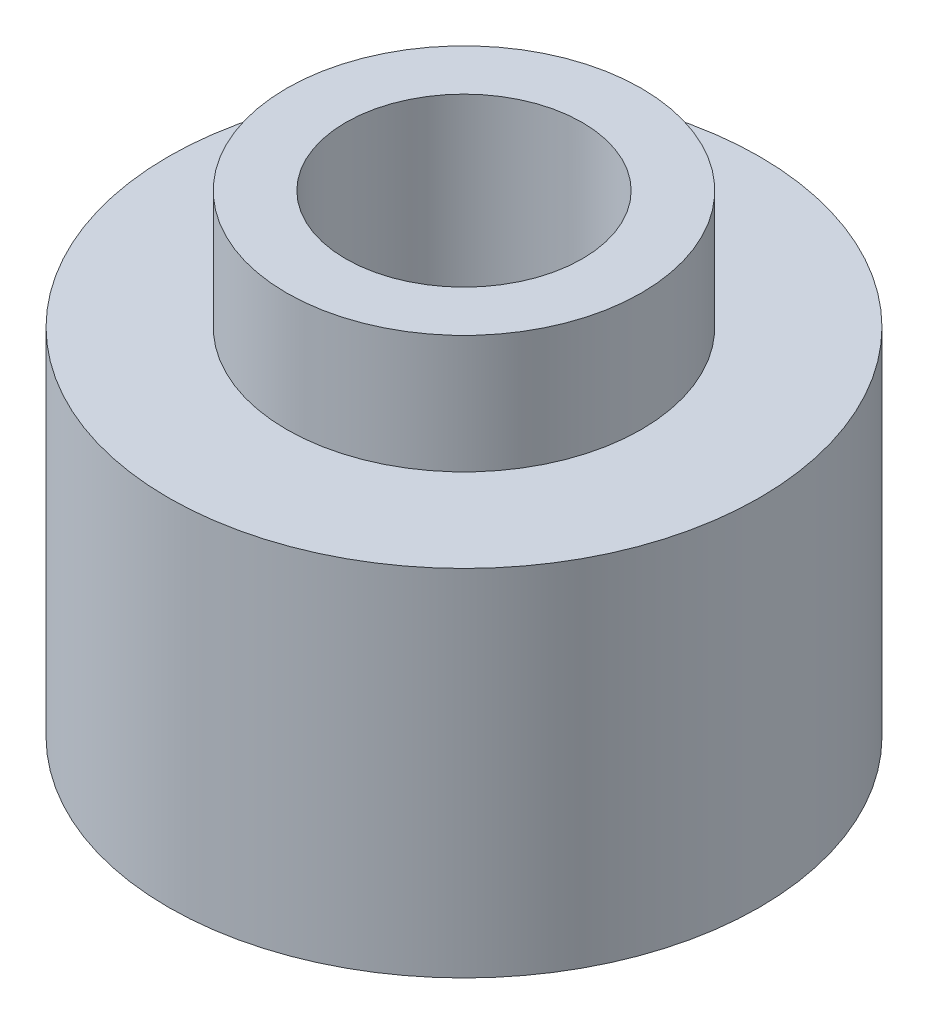
ISO-10303-21;
HEADER;
FILE_DESCRIPTION(('STEP AP214'),'2;1');
FILE_NAME('part.step','',(''),(''),'','','');
FILE_SCHEMA(('AUTOMOTIVE_DESIGN { 1 0 10303 214 1 1 1 1 }'));
ENDSEC;
DATA;
#1=APPLICATION_CONTEXT('core data for automotive mechanical design processes');
#2=APPLICATION_PROTOCOL_DEFINITION('international standard','automotive_design',2000,#1);
#3=PRODUCT_CONTEXT('',#1,'mechanical');
#4=PRODUCT('Part','Part','',(#3));
#5=PRODUCT_RELATED_PRODUCT_CATEGORY('part','',(#4));
#6=PRODUCT_DEFINITION_FORMATION('','',#4);
#7=PRODUCT_DEFINITION_CONTEXT('part definition',#1,'design');
#8=PRODUCT_DEFINITION('design','',#6,#7);
#9=PRODUCT_DEFINITION_SHAPE('','',#8);
#10=(LENGTH_UNIT() NAMED_UNIT(*) SI_UNIT(.MILLI.,.METRE.));
#11=(NAMED_UNIT(*) PLANE_ANGLE_UNIT() SI_UNIT($,.RADIAN.));
#12=(NAMED_UNIT(*) SI_UNIT($,.STERADIAN.) SOLID_ANGLE_UNIT());
#13=UNCERTAINTY_MEASURE_WITH_UNIT(LENGTH_MEASURE(1.E-05),#10,'distance_accuracy_value','');
#14=(GEOMETRIC_REPRESENTATION_CONTEXT(3) GLOBAL_UNCERTAINTY_ASSIGNED_CONTEXT((#13)) GLOBAL_UNIT_ASSIGNED_CONTEXT((#10,
#11,#12)) REPRESENTATION_CONTEXT('',''));
#15=CARTESIAN_POINT('',(0.,0.,0.));
#16=DIRECTION('',(0.,0.,1.));
#17=DIRECTION('',(1.,0.,0.));
#18=AXIS2_PLACEMENT_3D('',#15,#16,#17);
#19=CARTESIAN_POINT('',(0.,9.525,0.));
#20=DIRECTION('',(0.,1.,0.));
#21=DIRECTION('',(0.,0.,1.));
#22=AXIS2_PLACEMENT_3D('',#19,#20,#21);
#23=PLANE('',#22);
#24=CARTESIAN_POINT('',(0.,9.525,0.));
#25=DIRECTION('',(0.,1.,0.));
#26=DIRECTION('',(0.,0.,1.));
#27=AXIS2_PLACEMENT_3D('',#24,#25,#26);
#28=CIRCLE('',#27,7.9375);
#29=CARTESIAN_POINT('',(0.,9.525,7.9375));
#30=VERTEX_POINT('',#29);
#31=EDGE_CURVE('E10',#30,#30,#28,.T.);
#32=ORIENTED_EDGE('',*,*,#31,.T.);
#33=EDGE_LOOP('',(#32));
#34=FACE_BOUND('',#33,.T.);
#35=CARTESIAN_POINT('',(0.,9.525,0.));
#36=DIRECTION('',(0.,1.,0.));
#37=DIRECTION('',(0.,0.,1.));
#38=AXIS2_PLACEMENT_3D('',#35,#36,#37);
#39=CIRCLE('',#38,4.7625);
#40=CARTESIAN_POINT('',(0.,9.525,4.7625));
#41=VERTEX_POINT('',#40);
#42=EDGE_CURVE('E46',#41,#41,#39,.T.);
#43=ORIENTED_EDGE('',*,*,#42,.F.);
#44=EDGE_LOOP('',(#43));
#45=FACE_BOUND('',#44,.T.);
#46=ADVANCED_FACE('F32',(#34,#45),#23,.T.);
#47=CARTESIAN_POINT('',(0.,9.525,0.));
#48=DIRECTION('',(0.,-1.,0.));
#49=DIRECTION('',(0.,0.,-1.));
#50=AXIS2_PLACEMENT_3D('',#47,#48,#49);
#51=CYLINDRICAL_SURFACE('',#50,7.9375);
#52=CARTESIAN_POINT('',(0.,6.78179999999999,-7.9375));
#53=CARTESIAN_POINT('',(-0.111503398078413,6.78179698912343,-7.93749816002049));
#54=CARTESIAN_POINT('',(-0.223040059295097,6.77253332479157,-7.93512712027587));
#55=CARTESIAN_POINT('',(-0.442912489839705,6.73578152283835,-7.92589845272975));
#56=CARTESIAN_POINT('',(-0.551246482298939,6.70828345972344,-7.9190383814496));
#57=CARTESIAN_POINT('',(-0.761507028243949,6.63600550537382,-7.9015906585303));
#58=CARTESIAN_POINT('',(-0.863441246794077,6.59124676497381,-7.89100757037762));
#59=CARTESIAN_POINT('',(-1.05835486949294,6.4857934442363,-7.86723867370605));
#60=CARTESIAN_POINT('',(-1.15133389403648,6.42509818876566,-7.85405275492695));
#61=CARTESIAN_POINT('',(-1.32767529850183,6.28813138587943,-7.82619410708127));
#62=CARTESIAN_POINT('',(-1.41082008434518,6.2115844770594,-7.8114977905554));
#63=CARTESIAN_POINT('',(-1.56324103842942,6.04567656436284,-7.78243004832225));
#64=CARTESIAN_POINT('',(-1.63251558597806,5.95631406511751,-7.7680586607557));
#65=CARTESIAN_POINT('',(-1.75626265170812,5.76560990719252,-7.74102926906689));
#66=CARTESIAN_POINT('',(-1.81048997798445,5.66410452084263,-7.72840116269003));
#67=CARTESIAN_POINT('',(-1.90102585405554,5.45304502941796,-7.70663285880925));
#68=CARTESIAN_POINT('',(-1.93733738079571,5.34349226499878,-7.69749208189701));
#69=CARTESIAN_POINT('',(-1.99026513489226,5.12184498192214,-7.6839761021266));
#70=CARTESIAN_POINT('',(-2.00727345615104,5.00985000440968,-7.67950617818345));
#71=CARTESIAN_POINT('',(-2.02233359726657,4.78451398081111,-7.67555461600948));
#72=CARTESIAN_POINT('',(-2.02038861805277,4.67117316524618,-7.67607213547378));
#73=CARTESIAN_POINT('',(-1.99790980194531,4.44938201887053,-7.68195193484191));
#74=CARTESIAN_POINT('',(-1.97784503574137,4.3408803973632,-7.68719195548542));
#75=CARTESIAN_POINT('',(-1.92044525717152,4.12883634559916,-7.70173126273645));
#76=CARTESIAN_POINT('',(-1.88310897561297,4.02529428041127,-7.71103084765711));
#77=CARTESIAN_POINT('',(-1.79183081789414,3.82485981159055,-7.73275244872648));
#78=CARTESIAN_POINT('',(-1.73772020622837,3.72804780560333,-7.74520594630838));
#79=CARTESIAN_POINT('',(-1.61454732074231,3.54471055787542,-7.77181462555737));
#80=CARTESIAN_POINT('',(-1.54548234539153,3.45818717917316,-7.78597011448625));
#81=CARTESIAN_POINT('',(-1.39193958661512,3.29519725375498,-7.81490107198831));
#82=CARTESIAN_POINT('',(-1.30706645875347,3.21910371158737,-7.82968249645328));
#83=CARTESIAN_POINT('',(-1.12558600074782,3.08215746969765,-7.8578229461783));
#84=CARTESIAN_POINT('',(-1.0289782868209,3.02130526864727,-7.87118192489005));
#85=CARTESIAN_POINT('',(-0.826227078247713,2.91642513432796,-7.89504267368315));
#86=CARTESIAN_POINT('',(-0.72004998832284,2.87245957041766,-7.9055338112987));
#87=CARTESIAN_POINT('',(-0.50148514980063,2.80310646226061,-7.92239962662862));
#88=CARTESIAN_POINT('',(-0.38909863743981,2.77771523427372,-7.92877512054522));
#89=CARTESIAN_POINT('',(-0.164492808121926,2.74680534291312,-7.93656983337389));
#90=CARTESIAN_POINT('',(-0.0523476554168236,2.74077894006611,-7.93811565401553));
#91=CARTESIAN_POINT('',(0.171349315723136,2.74737469609084,-7.93643831154206));
#92=CARTESIAN_POINT('',(0.282901188617941,2.75999511256082,-7.93321559401008));
#93=CARTESIAN_POINT('',(0.500468334229656,2.80310824600407,-7.92244458469611));
#94=CARTESIAN_POINT('',(0.606542457585203,2.83332236545905,-7.9149637609624));
#95=CARTESIAN_POINT('',(0.812109942194255,2.91044564888721,-7.89652100083225));
#96=CARTESIAN_POINT('',(0.911602624249008,2.95735653277375,-7.88555870582623));
#97=CARTESIAN_POINT('',(1.10319094964695,3.06751477950432,-7.86106744858432));
#98=CARTESIAN_POINT('',(1.19511864088525,3.13104441859566,-7.84749533139252));
#99=CARTESIAN_POINT('',(1.36718817481565,3.27227754808179,-7.81935530263441));
#100=CARTESIAN_POINT('',(1.44732790279812,3.34998357607156,-7.80478721307994));
#101=CARTESIAN_POINT('',(1.59565130804696,3.51972446675716,-7.77583879234541));
#102=CARTESIAN_POINT('',(1.66347825059062,3.61207402132274,-7.76147270708816));
#103=CARTESIAN_POINT('',(1.78267397543408,3.80714232519226,-7.73496752417001));
#104=CARTESIAN_POINT('',(1.83404348103489,3.90986061853124,-7.72282832864778));
#105=CARTESIAN_POINT('',(1.91848150117721,4.1222071234346,-7.70228694397818));
#106=CARTESIAN_POINT('',(1.95165820338814,4.23179007123806,-7.69386272288785));
#107=CARTESIAN_POINT('',(1.99904730167293,4.45522665012093,-7.68168770839288));
#108=CARTESIAN_POINT('',(2.01326402212316,4.56907930127742,-7.67793584933284));
#109=CARTESIAN_POINT('',(2.02209764720633,4.79418772362286,-7.67561362323475));
#110=CARTESIAN_POINT('',(2.01728551668371,4.90541988430453,-7.67689230766973));
#111=CARTESIAN_POINT('',(1.9895093545208,5.1254307064123,-7.68413695162975));
#112=CARTESIAN_POINT('',(1.96654571308604,5.23420942052878,-7.69010281039395));
#113=CARTESIAN_POINT('',(1.90343529435007,5.44557948355125,-7.70596396634511));
#114=CARTESIAN_POINT('',(1.86339919983679,5.54820591293092,-7.71583392345196));
#115=CARTESIAN_POINT('',(1.76736739517097,5.74535957746386,-7.73839394276666));
#116=CARTESIAN_POINT('',(1.71136939438348,5.83988564763003,-7.75108440967796));
#117=CARTESIAN_POINT('',(1.58322877348736,6.02090577107196,-7.77828294081991));
#118=CARTESIAN_POINT('',(1.51069165506314,6.10711463465049,-7.79283077842512));
#119=CARTESIAN_POINT('',(1.35229586813726,6.26632220036619,-7.82187150616117));
#120=CARTESIAN_POINT('',(1.26643402294028,6.33931774335412,-7.83636438234261));
#121=CARTESIAN_POINT('',(1.08186355587165,6.4713774561622,-7.86398994917061));
#122=CARTESIAN_POINT('',(0.982942434749127,6.53015161192483,-7.87709168255394));
#123=CARTESIAN_POINT('',(0.776297761221595,6.63014258735775,-7.90012920674897));
#124=CARTESIAN_POINT('',(0.668580410982256,6.67137165271294,-7.91006720448157));
#125=CARTESIAN_POINT('',(0.467589183826792,6.72917236240341,-7.92423545810886));
#126=CARTESIAN_POINT('',(0.375250208911855,6.74886426268904,-7.92917496350255));
#127=CARTESIAN_POINT('',(0.188615316992517,6.77517882647048,-7.93580788140303));
#128=CARTESIAN_POINT('',(0.0943195588683765,6.781802546869,-7.93750155641943));
#129=CARTESIAN_POINT('',(0.,6.78179999999999,-7.9375));
#130=B_SPLINE_CURVE_WITH_KNOTS('',3,(#52,#53,#54,#55,#56,#57,#58,#59,#60,#61,#62,#63,#64,#65,
#66,#67,#68,#69,#70,#71,#72,#73,#74,#75,#76,#77,#78,#79,#80,#81,#82,#83,#84,#85,#86,#87,#88,#89,
#90,#91,#92,#93,#94,#95,#96,#97,#98,#99,#100,#101,#102,#103,#104,#105,#106,#107,#108,#109,#110,
#111,#112,#113,#114,#115,#116,#117,#118,#119,#120,#121,#122,#123,#124,#125,#126,#127,#128,#129),
.UNSPECIFIED.,.T.,.F.,(4,2,2,2,2,2,2,2,2,2,2,2,2,2,2,2,2,2,2,2,2,2,2,2,2,2,2,2,2,2,2,2,2,2,2,2,
2,2,4),(0.,0.334164484371241,0.668511013298198,1.00244913692187,1.33640140975415,
1.67673208193919,2.01710249747929,2.36273092362982,2.70830189971986,3.04672031013988,
3.38508156773417,3.71492705213757,4.04479677899854,4.37809872679735,4.71146093645367,
5.05467999197064,5.39791027558673,5.74239633260811,6.08681405117476,6.4221242648592,
6.75740314836629,7.08751192486792,7.4176547153184,7.75381718860838,8.09003989463379,
8.43483092612514,8.77960680204131,9.12230951849167,9.46493405822523,9.79735724148907,
10.1297732788005,10.4600662257494,10.790406595718,11.1296514585424,11.468977323992,
11.8147293837015,12.1602397266312,12.4429288345909,12.7255950788359),.UNSPECIFIED.);
#131=CARTESIAN_POINT('',(0.,6.78179999999999,-7.9375));
#132=VERTEX_POINT('',#131);
#133=EDGE_CURVE('E57',#132,#132,#130,.T.);
#134=ORIENTED_EDGE('',*,*,#133,.T.);
#135=EDGE_LOOP('',(#134));
#136=FACE_BOUND('',#135,.T.);
#137=ORIENTED_EDGE('',*,*,#31,.F.);
#138=EDGE_LOOP('',(#137));
#139=FACE_BOUND('',#138,.T.);
#140=CARTESIAN_POINT('',(0.,0.,0.));
#141=DIRECTION('',(0.,1.,0.));
#142=DIRECTION('',(0.,0.,1.));
#143=AXIS2_PLACEMENT_3D('',#140,#141,#142);
#144=CIRCLE('',#143,7.9375);
#145=CARTESIAN_POINT('',(0.,0.,7.9375));
#146=VERTEX_POINT('',#145);
#147=EDGE_CURVE('E37',#146,#146,#144,.T.);
#148=ORIENTED_EDGE('',*,*,#147,.T.);
#149=EDGE_LOOP('',(#148));
#150=FACE_BOUND('',#149,.T.);
#151=ADVANCED_FACE('F34',(#136,#139,#150),#51,.T.);
#152=CARTESIAN_POINT('',(0.,0.,0.));
#153=DIRECTION('',(0.,1.,0.));
#154=DIRECTION('',(0.,0.,1.));
#155=AXIS2_PLACEMENT_3D('',#152,#153,#154);
#156=PLANE('',#155);
#157=CARTESIAN_POINT('',(0.,0.,0.));
#158=DIRECTION('',(0.,-1.,0.));
#159=DIRECTION('',(0.,0.,-1.));
#160=AXIS2_PLACEMENT_3D('',#157,#158,#159);
#161=CIRCLE('',#160,3.17499999999999);
#162=CARTESIAN_POINT('',(0.,0.,-3.17499999999999));
#163=VERTEX_POINT('',#162);
#164=EDGE_CURVE('E54',#163,#163,#161,.T.);
#165=ORIENTED_EDGE('',*,*,#164,.F.);
#166=EDGE_LOOP('',(#165));
#167=FACE_BOUND('',#166,.T.);
#168=ORIENTED_EDGE('',*,*,#147,.F.);
#169=EDGE_LOOP('',(#168));
#170=FACE_BOUND('',#169,.T.);
#171=ADVANCED_FACE('F85',(#167,#170),#156,.F.);
#172=CARTESIAN_POINT('',(0.,12.7,0.));
#173=DIRECTION('',(0.,-1.,0.));
#174=DIRECTION('',(0.,0.,-1.));
#175=AXIS2_PLACEMENT_3D('',#172,#173,#174);
#176=CYLINDRICAL_SURFACE('',#175,4.7625);
#177=CARTESIAN_POINT('',(0.,12.7,0.));
#178=DIRECTION('',(0.,1.,0.));
#179=DIRECTION('',(0.,0.,1.));
#180=AXIS2_PLACEMENT_3D('',#177,#178,#179);
#181=CIRCLE('',#180,4.7625);
#182=CARTESIAN_POINT('',(0.,12.7,4.7625));
#183=VERTEX_POINT('',#182);
#184=EDGE_CURVE('E44',#183,#183,#181,.T.);
#185=ORIENTED_EDGE('',*,*,#184,.F.);
#186=EDGE_LOOP('',(#185));
#187=FACE_BOUND('',#186,.T.);
#188=ORIENTED_EDGE('',*,*,#42,.T.);
#189=EDGE_LOOP('',(#188));
#190=FACE_BOUND('',#189,.T.);
#191=ADVANCED_FACE('F81',(#187,#190),#176,.T.);
#192=CARTESIAN_POINT('',(0.,12.7,0.));
#193=DIRECTION('',(0.,1.,0.));
#194=DIRECTION('',(0.,0.,1.));
#195=AXIS2_PLACEMENT_3D('',#192,#193,#194);
#196=PLANE('',#195);
#197=CARTESIAN_POINT('',(0.,12.7,0.));
#198=DIRECTION('',(0.,-1.,0.));
#199=DIRECTION('',(0.,0.,-1.));
#200=AXIS2_PLACEMENT_3D('',#197,#198,#199);
#201=CIRCLE('',#200,3.175);
#202=CARTESIAN_POINT('',(0.,12.7,-3.175));
#203=VERTEX_POINT('',#202);
#204=EDGE_CURVE('E49',#203,#203,#201,.T.);
#205=ORIENTED_EDGE('',*,*,#204,.T.);
#206=EDGE_LOOP('',(#205));
#207=FACE_BOUND('',#206,.T.);
#208=ORIENTED_EDGE('',*,*,#184,.T.);
#209=EDGE_LOOP('',(#208));
#210=FACE_BOUND('',#209,.T.);
#211=ADVANCED_FACE('F77',(#207,#210),#196,.T.);
#212=CARTESIAN_POINT('',(0.,0.,0.));
#213=DIRECTION('',(0.,-1.,0.));
#214=DIRECTION('',(0.,0.,-1.));
#215=AXIS2_PLACEMENT_3D('',#212,#213,#214);
#216=CYLINDRICAL_SURFACE('',#215,3.17499999999999);
#217=CARTESIAN_POINT('',(0.,6.78179999999999,-3.17499999999999));
#218=CARTESIAN_POINT('',(0.102275041570351,6.78179143965553,-3.17499212218741));
#219=CARTESIAN_POINT('',(0.204663948744718,6.77397696356883,-3.17000679874074));
#220=CARTESIAN_POINT('',(0.406278072049933,6.74314527104775,-3.15053510862913));
#221=CARTESIAN_POINT('',(0.505497460962833,6.72010157203822,-3.13603219182986));
#222=CARTESIAN_POINT('',(0.697469668100846,6.66017536654758,-3.09897945913748));
#223=CARTESIAN_POINT('',(0.790251965874982,6.62336167332953,-3.07646968317456));
#224=CARTESIAN_POINT('',(0.967983856054422,6.53741840151875,-3.02526013654448));
#225=CARTESIAN_POINT('',(1.05293403637499,6.48828974837558,-2.99656083103319));
#226=CARTESIAN_POINT('',(1.22039873226055,6.37472031168926,-2.93256277924018));
#227=CARTESIAN_POINT('',(1.3021541541713,6.30935956659122,-2.89691724195524));
#228=CARTESIAN_POINT('',(1.45427585258572,6.16731514759952,-2.82362413681096));
#229=CARTESIAN_POINT('',(1.52462619854515,6.09061591706343,-2.785973864556));
#230=CARTESIAN_POINT('',(1.66206543309412,5.91541312688874,-2.70653031413332));
#231=CARTESIAN_POINT('',(1.72729055130935,5.81535997830798,-2.66490287506757));
#232=CARTESIAN_POINT('',(1.83983395520866,5.60329070068756,-2.58848866777313));
#233=CARTESIAN_POINT('',(1.88718285725214,5.49129545063197,-2.55369025311666));
#234=CARTESIAN_POINT('',(1.95156224001302,5.28885357353124,-2.50463798235852));
#235=CARTESIAN_POINT('',(1.97331282288364,5.20064159918013,-2.48737926319142));
#236=CARTESIAN_POINT('',(2.00477482055267,5.02085587735079,-2.46209734155055));
#237=CARTESIAN_POINT('',(2.01450417871409,4.92928735088703,-2.45406037559984));
#238=CARTESIAN_POINT('',(2.02133295126505,4.74507355599231,-2.44844089318851));
#239=CARTESIAN_POINT('',(2.01839497710359,4.65242590612286,-2.45088932499694));
#240=CARTESIAN_POINT('',(2.00000919911576,4.46919107819911,-2.46591124637831));
#241=CARTESIAN_POINT('',(1.98455114545894,4.37860565092147,-2.47849303179025));
#242=CARTESIAN_POINT('',(1.94264067552021,4.20434339425292,-2.51146346059049));
#243=CARTESIAN_POINT('',(1.91650651911699,4.12054440836868,-2.53162486882099));
#244=CARTESIAN_POINT('',(1.85432038094187,3.9583731400466,-2.57752031440749));
#245=CARTESIAN_POINT('',(1.81826508780771,3.88000268043073,-2.60325621174053));
#246=CARTESIAN_POINT('',(1.72932876824588,3.71493579137508,-2.66335210414008));
#247=CARTESIAN_POINT('',(1.67454743777151,3.62952187685321,-2.69841965448579));
#248=CARTESIAN_POINT('',(1.55319088466406,3.46813486180489,-2.77005411277687));
#249=CARTESIAN_POINT('',(1.48660181281294,3.39217302756344,-2.80662274219304));
#250=CARTESIAN_POINT('',(1.32960028569559,3.23807019316479,-2.88474864185398));
#251=CARTESIAN_POINT('',(1.23705711933929,3.16194035607165,-2.92603774183836));
#252=CARTESIAN_POINT('',(1.03819212296361,3.02636503185775,-3.0023466045187));
#253=CARTESIAN_POINT('',(0.931885390793916,2.96690148568991,-3.03737313810321));
#254=CARTESIAN_POINT('',(0.730092345463674,2.87724166959082,-3.09131764246757));
#255=CARTESIAN_POINT('',(0.636630347052198,2.84358185090811,-3.1120518646395));
#256=CARTESIAN_POINT('',(0.444413569663533,2.7901928869013,-3.14525139549152));
#257=CARTESIAN_POINT('',(0.345663072769135,2.77045264907093,-3.15772328793694));
#258=CARTESIAN_POINT('',(0.145247031751,2.74589454573657,-3.17327247447324));
#259=CARTESIAN_POINT('',(0.0435731547102236,2.74112473926988,-3.1763195118384));
#260=CARTESIAN_POINT('',(-0.15916156483049,2.74692972240651,-3.17262837891011));
#261=CARTESIAN_POINT('',(-0.260222360951869,2.7575056587059,-3.16588947737161));
#262=CARTESIAN_POINT('',(-0.453545546030749,2.79246601072033,-3.14386957546432));
#263=CARTESIAN_POINT('',(-0.545994183259851,2.8161225857849,-3.12903933230955));
#264=CARTESIAN_POINT('',(-0.725383942286239,2.87561671025775,-3.09238314692142));
#265=CARTESIAN_POINT('',(-0.812324132435724,2.91145631370092,-3.0705560250633));
#266=CARTESIAN_POINT('',(-0.985513554819461,2.99717530932715,-3.01962653249604));
#267=CARTESIAN_POINT('',(-1.07120913338102,3.04791408167717,-2.99009760848239));
#268=CARTESIAN_POINT('',(-1.23329766280981,3.16053071630235,-2.92697501640169));
#269=CARTESIAN_POINT('',(-1.30968310074507,3.22241747610095,-2.89337810863513));
#270=CARTESIAN_POINT('',(-1.46312883138037,3.36625409201893,-2.81925311715626));
#271=CARTESIAN_POINT('',(-1.53853997670989,3.44982295961586,-2.77844582051284));
#272=CARTESIAN_POINT('',(-1.67482589073675,3.62883900935265,-2.69848578412997));
#273=CARTESIAN_POINT('',(-1.73569878964202,3.72428771698307,-2.65933325774612));
#274=CARTESIAN_POINT('',(-1.83384260188465,3.91155126738816,-2.59242399914095));
#275=CARTESIAN_POINT('',(-1.87323995547865,4.00194852413951,-2.56383843593365));
#276=CARTESIAN_POINT('',(-1.93881492302713,4.1894369771566,-2.5146197524449));
#277=CARTESIAN_POINT('',(-1.96501114696942,4.28651852954775,-2.49397544693689));
#278=CARTESIAN_POINT('',(-2.00290039729267,4.48617278433906,-2.46366295169804));
#279=CARTESIAN_POINT('',(-2.01446098670787,4.58878699003586,-2.45409505725332));
#280=CARTESIAN_POINT('',(-2.02166710369554,4.79493308207037,-2.44816666813602));
#281=CARTESIAN_POINT('',(-2.01732235383119,4.89846436921506,-2.45179810501019));
#282=CARTESIAN_POINT('',(-1.99481282731698,5.08832672014838,-2.47012079556711));
#283=CARTESIAN_POINT('',(-1.97863020035238,5.17506561157787,-2.48322286589142));
#284=CARTESIAN_POINT('',(-1.93562453165795,5.34436883614592,-2.51688812246691));
#285=CARTESIAN_POINT('',(-1.9087912546343,5.42692906728015,-2.53745848413262));
#286=CARTESIAN_POINT('',(-1.83453213645738,5.61421779929931,-2.59188888887617));
#287=CARTESIAN_POINT('',(-1.78319601633737,5.7167730499475,-2.62788562529028));
#288=CARTESIAN_POINT('',(-1.66498968273405,5.91067919342465,-2.7043292435251));
#289=CARTESIAN_POINT('',(-1.59809863913568,6.00201480877443,-2.74478205404975));
#290=CARTESIAN_POINT('',(-1.44926145737011,6.17324698784758,-2.82622298925021));
#291=CARTESIAN_POINT('',(-1.3671568638917,6.25300573592318,-2.86721208276523));
#292=CARTESIAN_POINT('',(-1.18954498293631,6.39826450612534,-2.94534120010864));
#293=CARTESIAN_POINT('',(-1.09403777754425,6.46376461557333,-2.98248124750826));
#294=CARTESIAN_POINT('',(-0.888385881992076,6.5797993376485,-3.05013846389933));
#295=CARTESIAN_POINT('',(-0.777927590640482,6.62990513314878,-3.0804604560015));
#296=CARTESIAN_POINT('',(-0.605427728914402,6.6898677860614,-3.11730041421456));
#297=CARTESIAN_POINT('',(-0.546842243784919,6.707314719106,-3.12813464368598));
#298=CARTESIAN_POINT('',(-0.427869843173641,6.73689774274739,-3.14661127671427));
#299=CARTESIAN_POINT('',(-0.367484242510029,6.74903761283079,-3.15425595157205));
#300=CARTESIAN_POINT('',(-0.255971221121616,6.76616340176665,-3.16507251999972));
#301=CARTESIAN_POINT('',(-0.205027735964822,6.77201801938967,-3.16878594100634));
#302=CARTESIAN_POINT('',(-0.102732421224254,6.77983852709741,-3.17375169673816));
#303=CARTESIAN_POINT('',(-0.0513805794361023,6.78180430051605,-3.17500395762806));
#304=CARTESIAN_POINT('',(0.,6.78179999999999,-3.17499999999999));
#305=B_SPLINE_CURVE_WITH_KNOTS('',3,(#217,#218,#219,#220,#221,#222,#223,#224,#225,#226,#227,
#228,#229,#230,#231,#232,#233,#234,#235,#236,#237,#238,#239,#240,#241,#242,#243,#244,#245,#246,
#247,#248,#249,#250,#251,#252,#253,#254,#255,#256,#257,#258,#259,#260,#261,#262,#263,#264,#265,
#266,#267,#268,#269,#270,#271,#272,#273,#274,#275,#276,#277,#278,#279,#280,#281,#282,#283,#284,
#285,#286,#287,#288,#289,#290,#291,#292,#293,#294,#295,#296,#297,#298,#299,#300,#301,#302,#303,
#304),.UNSPECIFIED.,.T.,.F.,(4,2,2,2,2,2,2,2,2,2,2,2,2,2,2,2,2,2,2,2,2,2,2,2,2,2,2,2,2,2,2,2,2,
2,2,2,2,2,2,2,2,2,2,4),(0.,0.306618688447366,0.613771973685193,0.919410384700765,
1.2250258343603,1.55547991466606,1.88639166683373,2.26403741166171,2.64103340143298,
2.91733101609382,3.19321571765492,3.46991526949969,3.74684157658549,4.01605368121483,
4.28535574956627,4.60626536454537,4.92755389229747,5.3059319215214,5.68389835350099,
5.98703820526839,6.28993621120917,6.59380561032802,6.89769771696903,7.18617094760006,
7.47469283839889,7.78512110231493,8.09579823449314,8.45351764572918,8.81128303920727,
9.11810928918365,9.42450177937297,9.73364742929525,10.0426041372508,10.3090843788023,
10.5758213307902,10.9345409073162,11.293743651991,11.6569225744499,12.0200992726999,
12.3926282643871,12.5785937254861,12.7644265325087,12.918459941123,13.0724979706996),.UNSPECIFIED.);
#306=CARTESIAN_POINT('',(0.,6.78179999999999,-3.17499999999999));
#307=VERTEX_POINT('',#306);
#308=EDGE_CURVE('E63',#307,#307,#305,.T.);
#309=ORIENTED_EDGE('',*,*,#308,.T.);
#310=EDGE_LOOP('',(#309));
#311=FACE_BOUND('',#310,.T.);
#312=ORIENTED_EDGE('',*,*,#204,.F.);
#313=EDGE_LOOP('',(#312));
#314=FACE_BOUND('',#313,.T.);
#315=ORIENTED_EDGE('',*,*,#164,.T.);
#316=EDGE_LOOP('',(#315));
#317=FACE_BOUND('',#316,.T.);
#318=ADVANCED_FACE('F70',(#311,#314,#317),#216,.F.);
#319=CARTESIAN_POINT('',(0.,4.7625,-7.9375));
#320=DIRECTION('',(0.,0.,-1.));
#321=DIRECTION('',(-1.,0.,0.));
#322=AXIS2_PLACEMENT_3D('',#319,#320,#321);
#323=CYLINDRICAL_SURFACE('',#322,2.01929999999999);
#324=ORIENTED_EDGE('',*,*,#308,.F.);
#325=EDGE_LOOP('',(#324));
#326=FACE_BOUND('',#325,.T.);
#327=ORIENTED_EDGE('',*,*,#133,.F.);
#328=EDGE_LOOP('',(#327));
#329=FACE_BOUND('',#328,.T.);
#330=ADVANCED_FACE('F67',(#326,#329),#323,.F.);
#331=CLOSED_SHELL('',(#46,#151,#171,#191,#211,#318,#330));
#332=MANIFOLD_SOLID_BREP('B2',#331);
#333=ADVANCED_BREP_SHAPE_REPRESENTATION('',(#18,#332),#14);
#334=SHAPE_DEFINITION_REPRESENTATION(#9,#333);
ENDSEC;
END-ISO-10303-21;
